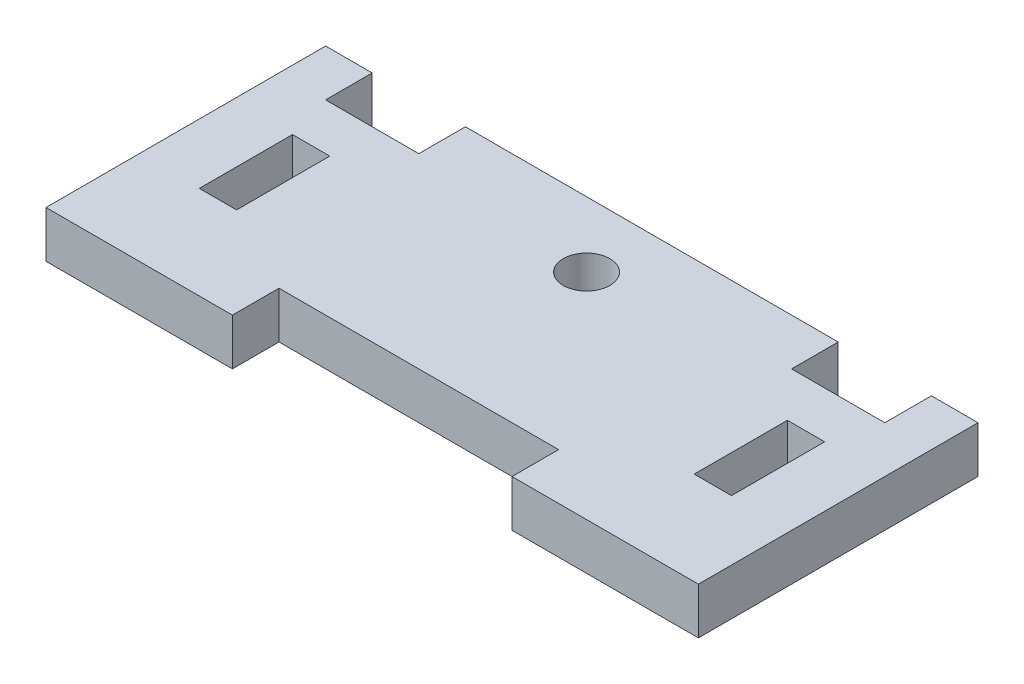
ISO-10303-21;
HEADER;
FILE_DESCRIPTION(('STEP AP214'),'2;1');
FILE_NAME('part.step','',(''),(''),'','','');
FILE_SCHEMA(('AUTOMOTIVE_DESIGN { 1 0 10303 214 1 1 1 1 }'));
ENDSEC;
DATA;
#1=APPLICATION_CONTEXT('core data for automotive mechanical design processes');
#2=APPLICATION_PROTOCOL_DEFINITION('international standard','automotive_design',2000,#1);
#3=PRODUCT_CONTEXT('',#1,'mechanical');
#4=PRODUCT('Part','Part','',(#3));
#5=PRODUCT_RELATED_PRODUCT_CATEGORY('part','',(#4));
#6=PRODUCT_DEFINITION_FORMATION('','',#4);
#7=PRODUCT_DEFINITION_CONTEXT('part definition',#1,'design');
#8=PRODUCT_DEFINITION('design','',#6,#7);
#9=PRODUCT_DEFINITION_SHAPE('','',#8);
#10=(LENGTH_UNIT() NAMED_UNIT(*) SI_UNIT(.MILLI.,.METRE.));
#11=(NAMED_UNIT(*) PLANE_ANGLE_UNIT() SI_UNIT($,.RADIAN.));
#12=(NAMED_UNIT(*) SI_UNIT($,.STERADIAN.) SOLID_ANGLE_UNIT());
#13=UNCERTAINTY_MEASURE_WITH_UNIT(LENGTH_MEASURE(1.E-05),#10,'distance_accuracy_value','');
#14=(GEOMETRIC_REPRESENTATION_CONTEXT(3) GLOBAL_UNCERTAINTY_ASSIGNED_CONTEXT((#13)) GLOBAL_UNIT_ASSIGNED_CONTEXT((#10,
#11,#12)) REPRESENTATION_CONTEXT('',''));
#15=CARTESIAN_POINT('',(0.,0.,0.));
#16=DIRECTION('',(0.,0.,1.));
#17=DIRECTION('',(1.,0.,0.));
#18=AXIS2_PLACEMENT_3D('',#15,#16,#17);
#19=CARTESIAN_POINT('',(0.,5.,0.));
#20=DIRECTION('',(0.,-1.,0.));
#21=DIRECTION('',(0.,0.,-1.));
#22=AXIS2_PLACEMENT_3D('',#19,#20,#21);
#23=PLANE('',#22);
#24=DIRECTION('',(0.,0.,1.));
#25=VECTOR('',#24,1.);
#26=CARTESIAN_POINT('',(6.45,5.,-20.));
#27=LINE('',#26,#25);
#28=CARTESIAN_POINT('',(6.45,5.,-20.));
#29=VERTEX_POINT('',#28);
#30=CARTESIAN_POINT('',(6.45,5.,-10.));
#31=VERTEX_POINT('',#30);
#32=EDGE_CURVE('E234',#29,#31,#27,.T.);
#33=ORIENTED_EDGE('',*,*,#32,.F.);
#34=DIRECTION('',(-1.,0.,0.));
#35=VECTOR('',#34,1.);
#36=CARTESIAN_POINT('',(6.45,5.,-20.));
#37=LINE('',#36,#35);
#38=CARTESIAN_POINT('',(10.45,5.,-20.));
#39=VERTEX_POINT('',#38);
#40=EDGE_CURVE('E242',#39,#29,#37,.T.);
#41=ORIENTED_EDGE('',*,*,#40,.F.);
#42=DIRECTION('',(0.,0.,-1.));
#43=VECTOR('',#42,1.);
#44=CARTESIAN_POINT('',(10.45,5.,-20.));
#45=LINE('',#44,#43);
#46=CARTESIAN_POINT('',(10.45,5.,-10.));
#47=VERTEX_POINT('',#46);
#48=EDGE_CURVE('E239',#47,#39,#45,.T.);
#49=ORIENTED_EDGE('',*,*,#48,.F.);
#50=DIRECTION('',(1.,0.,0.));
#51=VECTOR('',#50,1.);
#52=CARTESIAN_POINT('',(6.45,5.,-10.));
#53=LINE('',#52,#51);
#54=EDGE_CURVE('E236',#31,#47,#53,.T.);
#55=ORIENTED_EDGE('',*,*,#54,.F.);
#56=EDGE_LOOP('',(#33,#41,#49,#55));
#57=FACE_BOUND('',#56,.T.);
#58=DIRECTION('',(0.,0.,1.));
#59=VECTOR('',#58,1.);
#60=CARTESIAN_POINT('',(0.,5.,0.));
#61=LINE('',#60,#59);
#62=CARTESIAN_POINT('',(0.,5.,-30.));
#63=VERTEX_POINT('',#62);
#64=CARTESIAN_POINT('',(0.,5.,0.));
#65=VERTEX_POINT('',#64);
#66=EDGE_CURVE('E271',#63,#65,#61,.T.);
#67=ORIENTED_EDGE('',*,*,#66,.T.);
#68=DIRECTION('',(1.,0.,0.));
#69=VECTOR('',#68,1.);
#70=CARTESIAN_POINT('',(0.,5.,0.));
#71=LINE('',#70,#69);
#72=CARTESIAN_POINT('',(20.,5.,0.));
#73=VERTEX_POINT('',#72);
#74=EDGE_CURVE('E274',#65,#73,#71,.T.);
#75=ORIENTED_EDGE('',*,*,#74,.T.);
#76=DIRECTION('',(0.,0.,-1.));
#77=VECTOR('',#76,1.);
#78=CARTESIAN_POINT('',(20.,5.,0.));
#79=LINE('',#78,#77);
#80=CARTESIAN_POINT('',(20.,5.,-5.));
#81=VERTEX_POINT('',#80);
#82=EDGE_CURVE('E277',#73,#81,#79,.T.);
#83=ORIENTED_EDGE('',*,*,#82,.T.);
#84=DIRECTION('',(1.,0.,0.));
#85=VECTOR('',#84,1.);
#86=CARTESIAN_POINT('',(20.,5.,-5.));
#87=LINE('',#86,#85);
#88=CARTESIAN_POINT('',(50.,5.,-5.));
#89=VERTEX_POINT('',#88);
#90=EDGE_CURVE('E279',#81,#89,#87,.T.);
#91=ORIENTED_EDGE('',*,*,#90,.T.);
#92=DIRECTION('',(0.,0.,1.));
#93=VECTOR('',#92,1.);
#94=CARTESIAN_POINT('',(50.,5.,0.));
#95=LINE('',#94,#93);
#96=CARTESIAN_POINT('',(50.,5.,0.));
#97=VERTEX_POINT('',#96);
#98=EDGE_CURVE('E281',#89,#97,#95,.T.);
#99=ORIENTED_EDGE('',*,*,#98,.T.);
#100=DIRECTION('',(1.,0.,0.));
#101=VECTOR('',#100,1.);
#102=CARTESIAN_POINT('',(50.,5.,0.));
#103=LINE('',#102,#101);
#104=CARTESIAN_POINT('',(70.,5.,0.));
#105=VERTEX_POINT('',#104);
#106=EDGE_CURVE('E283',#97,#105,#103,.T.);
#107=ORIENTED_EDGE('',*,*,#106,.T.);
#108=DIRECTION('',(0.,0.,-1.));
#109=VECTOR('',#108,1.);
#110=CARTESIAN_POINT('',(70.,5.,0.));
#111=LINE('',#110,#109);
#112=CARTESIAN_POINT('',(70.,5.,-30.));
#113=VERTEX_POINT('',#112);
#114=EDGE_CURVE('E285',#105,#113,#111,.T.);
#115=ORIENTED_EDGE('',*,*,#114,.T.);
#116=DIRECTION('',(-1.,0.,0.));
#117=VECTOR('',#116,1.);
#118=CARTESIAN_POINT('',(65.,5.,-30.));
#119=LINE('',#118,#117);
#120=CARTESIAN_POINT('',(65.,5.,-30.));
#121=VERTEX_POINT('',#120);
#122=EDGE_CURVE('E287',#113,#121,#119,.T.);
#123=ORIENTED_EDGE('',*,*,#122,.T.);
#124=DIRECTION('',(0.,0.,1.));
#125=VECTOR('',#124,1.);
#126=CARTESIAN_POINT('',(65.,5.,-30.));
#127=LINE('',#126,#125);
#128=CARTESIAN_POINT('',(65.,5.,-25.));
#129=VERTEX_POINT('',#128);
#130=EDGE_CURVE('E289',#121,#129,#127,.T.);
#131=ORIENTED_EDGE('',*,*,#130,.T.);
#132=DIRECTION('',(-1.,0.,0.));
#133=VECTOR('',#132,1.);
#134=CARTESIAN_POINT('',(55.,5.,-25.));
#135=LINE('',#134,#133);
#136=CARTESIAN_POINT('',(55.,5.,-25.));
#137=VERTEX_POINT('',#136);
#138=EDGE_CURVE('E291',#129,#137,#135,.T.);
#139=ORIENTED_EDGE('',*,*,#138,.T.);
#140=DIRECTION('',(0.,0.,-1.));
#141=VECTOR('',#140,1.);
#142=CARTESIAN_POINT('',(55.,5.,-30.));
#143=LINE('',#142,#141);
#144=CARTESIAN_POINT('',(55.,5.,-30.));
#145=VERTEX_POINT('',#144);
#146=EDGE_CURVE('E293',#137,#145,#143,.T.);
#147=ORIENTED_EDGE('',*,*,#146,.T.);
#148=DIRECTION('',(-1.,0.,0.));
#149=VECTOR('',#148,1.);
#150=CARTESIAN_POINT('',(15.,5.,-30.));
#151=LINE('',#150,#149);
#152=CARTESIAN_POINT('',(15.,5.,-30.));
#153=VERTEX_POINT('',#152);
#154=EDGE_CURVE('E295',#145,#153,#151,.T.);
#155=ORIENTED_EDGE('',*,*,#154,.T.);
#156=DIRECTION('',(0.,0.,1.));
#157=VECTOR('',#156,1.);
#158=CARTESIAN_POINT('',(15.,5.,-30.));
#159=LINE('',#158,#157);
#160=CARTESIAN_POINT('',(15.,5.,-25.));
#161=VERTEX_POINT('',#160);
#162=EDGE_CURVE('E297',#153,#161,#159,.T.);
#163=ORIENTED_EDGE('',*,*,#162,.T.);
#164=DIRECTION('',(-1.,0.,0.));
#165=VECTOR('',#164,1.);
#166=CARTESIAN_POINT('',(5.,5.,-25.));
#167=LINE('',#166,#165);
#168=CARTESIAN_POINT('',(5.,5.,-25.));
#169=VERTEX_POINT('',#168);
#170=EDGE_CURVE('E299',#161,#169,#167,.T.);
#171=ORIENTED_EDGE('',*,*,#170,.T.);
#172=DIRECTION('',(0.,0.,-1.));
#173=VECTOR('',#172,1.);
#174=CARTESIAN_POINT('',(5.,5.,-30.));
#175=LINE('',#174,#173);
#176=CARTESIAN_POINT('',(5.,5.,-30.));
#177=VERTEX_POINT('',#176);
#178=EDGE_CURVE('E301',#169,#177,#175,.T.);
#179=ORIENTED_EDGE('',*,*,#178,.T.);
#180=DIRECTION('',(-1.,0.,0.));
#181=VECTOR('',#180,1.);
#182=CARTESIAN_POINT('',(0.,5.,-30.));
#183=LINE('',#182,#181);
#184=EDGE_CURVE('E303',#177,#63,#183,.T.);
#185=ORIENTED_EDGE('',*,*,#184,.T.);
#186=EDGE_LOOP('',(#67,#75,#83,#91,#99,#107,#115,#123,#131,#139,#147,#155,#163,#171,#179,#185));
#187=FACE_BOUND('',#186,.T.);
#188=CARTESIAN_POINT('',(35.,5.,-23.));
#189=DIRECTION('',(0.,1.,0.));
#190=DIRECTION('',(0.,0.,1.));
#191=AXIS2_PLACEMENT_3D('',#188,#189,#190);
#192=CIRCLE('',#191,2.5);
#193=CARTESIAN_POINT('',(35.,5.,-20.5));
#194=VERTEX_POINT('',#193);
#195=EDGE_CURVE('E265',#194,#194,#192,.T.);
#196=ORIENTED_EDGE('',*,*,#195,.F.);
#197=EDGE_LOOP('',(#196));
#198=FACE_BOUND('',#197,.T.);
#199=DIRECTION('',(0.,0.,1.));
#200=VECTOR('',#199,1.);
#201=CARTESIAN_POINT('',(59.55,5.,-20.));
#202=LINE('',#201,#200);
#203=CARTESIAN_POINT('',(59.55,5.,-20.));
#204=VERTEX_POINT('',#203);
#205=CARTESIAN_POINT('',(59.55,5.,-10.));
#206=VERTEX_POINT('',#205);
#207=EDGE_CURVE('E198',#204,#206,#202,.T.);
#208=ORIENTED_EDGE('',*,*,#207,.F.);
#209=DIRECTION('',(-1.,0.,0.));
#210=VECTOR('',#209,1.);
#211=CARTESIAN_POINT('',(59.55,5.,-20.));
#212=LINE('',#211,#210);
#213=CARTESIAN_POINT('',(63.55,5.,-20.));
#214=VERTEX_POINT('',#213);
#215=EDGE_CURVE('E220',#214,#204,#212,.T.);
#216=ORIENTED_EDGE('',*,*,#215,.F.);
#217=DIRECTION('',(0.,0.,-1.));
#218=VECTOR('',#217,1.);
#219=CARTESIAN_POINT('',(63.55,5.,-20.));
#220=LINE('',#219,#218);
#221=CARTESIAN_POINT('',(63.55,5.,-10.));
#222=VERTEX_POINT('',#221);
#223=EDGE_CURVE('E218',#222,#214,#220,.T.);
#224=ORIENTED_EDGE('',*,*,#223,.F.);
#225=DIRECTION('',(1.,0.,0.));
#226=VECTOR('',#225,1.);
#227=CARTESIAN_POINT('',(59.55,5.,-10.));
#228=LINE('',#227,#226);
#229=EDGE_CURVE('E206',#206,#222,#228,.T.);
#230=ORIENTED_EDGE('',*,*,#229,.F.);
#231=EDGE_LOOP('',(#208,#216,#224,#230));
#232=FACE_BOUND('',#231,.T.);
#233=ADVANCED_FACE('F37',(#57,#187,#198,#232),#23,.F.);
#234=CARTESIAN_POINT('',(0.,0.,0.));
#235=DIRECTION('',(0.,-1.,0.));
#236=DIRECTION('',(0.,0.,-1.));
#237=AXIS2_PLACEMENT_3D('',#234,#235,#236);
#238=PLANE('',#237);
#239=DIRECTION('',(0.,0.,1.));
#240=VECTOR('',#239,1.);
#241=CARTESIAN_POINT('',(0.,0.,0.));
#242=LINE('',#241,#240);
#243=CARTESIAN_POINT('',(0.,0.,-30.));
#244=VERTEX_POINT('',#243);
#245=CARTESIAN_POINT('',(0.,0.,0.));
#246=VERTEX_POINT('',#245);
#247=EDGE_CURVE('E268',#244,#246,#242,.T.);
#248=ORIENTED_EDGE('',*,*,#247,.F.);
#249=DIRECTION('',(-1.,0.,0.));
#250=VECTOR('',#249,1.);
#251=CARTESIAN_POINT('',(0.,0.,-30.));
#252=LINE('',#251,#250);
#253=CARTESIAN_POINT('',(5.,0.,-30.));
#254=VERTEX_POINT('',#253);
#255=EDGE_CURVE('E275',#254,#244,#252,.T.);
#256=ORIENTED_EDGE('',*,*,#255,.F.);
#257=DIRECTION('',(0.,0.,-1.));
#258=VECTOR('',#257,1.);
#259=CARTESIAN_POINT('',(5.,0.,-30.));
#260=LINE('',#259,#258);
#261=CARTESIAN_POINT('',(5.,0.,-25.));
#262=VERTEX_POINT('',#261);
#263=EDGE_CURVE('E334',#262,#254,#260,.T.);
#264=ORIENTED_EDGE('',*,*,#263,.F.);
#265=DIRECTION('',(-1.,0.,0.));
#266=VECTOR('',#265,1.);
#267=CARTESIAN_POINT('',(5.,0.,-25.));
#268=LINE('',#267,#266);
#269=CARTESIAN_POINT('',(15.,0.,-25.));
#270=VERTEX_POINT('',#269);
#271=EDGE_CURVE('E332',#270,#262,#268,.T.);
#272=ORIENTED_EDGE('',*,*,#271,.F.);
#273=DIRECTION('',(0.,0.,1.));
#274=VECTOR('',#273,1.);
#275=CARTESIAN_POINT('',(15.,0.,-30.));
#276=LINE('',#275,#274);
#277=CARTESIAN_POINT('',(15.,0.,-30.));
#278=VERTEX_POINT('',#277);
#279=EDGE_CURVE('E330',#278,#270,#276,.T.);
#280=ORIENTED_EDGE('',*,*,#279,.F.);
#281=DIRECTION('',(-1.,0.,0.));
#282=VECTOR('',#281,1.);
#283=CARTESIAN_POINT('',(15.,0.,-30.));
#284=LINE('',#283,#282);
#285=CARTESIAN_POINT('',(55.,0.,-30.));
#286=VERTEX_POINT('',#285);
#287=EDGE_CURVE('E328',#286,#278,#284,.T.);
#288=ORIENTED_EDGE('',*,*,#287,.F.);
#289=DIRECTION('',(0.,0.,-1.));
#290=VECTOR('',#289,1.);
#291=CARTESIAN_POINT('',(55.,0.,-30.));
#292=LINE('',#291,#290);
#293=CARTESIAN_POINT('',(55.,0.,-25.));
#294=VERTEX_POINT('',#293);
#295=EDGE_CURVE('E326',#294,#286,#292,.T.);
#296=ORIENTED_EDGE('',*,*,#295,.F.);
#297=DIRECTION('',(-1.,0.,0.));
#298=VECTOR('',#297,1.);
#299=CARTESIAN_POINT('',(55.,0.,-25.));
#300=LINE('',#299,#298);
#301=CARTESIAN_POINT('',(65.,0.,-25.));
#302=VERTEX_POINT('',#301);
#303=EDGE_CURVE('E324',#302,#294,#300,.T.);
#304=ORIENTED_EDGE('',*,*,#303,.F.);
#305=DIRECTION('',(0.,0.,1.));
#306=VECTOR('',#305,1.);
#307=CARTESIAN_POINT('',(65.,0.,-30.));
#308=LINE('',#307,#306);
#309=CARTESIAN_POINT('',(65.,0.,-30.));
#310=VERTEX_POINT('',#309);
#311=EDGE_CURVE('E322',#310,#302,#308,.T.);
#312=ORIENTED_EDGE('',*,*,#311,.F.);
#313=DIRECTION('',(-1.,0.,0.));
#314=VECTOR('',#313,1.);
#315=CARTESIAN_POINT('',(65.,0.,-30.));
#316=LINE('',#315,#314);
#317=CARTESIAN_POINT('',(70.,0.,-30.));
#318=VERTEX_POINT('',#317);
#319=EDGE_CURVE('E320',#318,#310,#316,.T.);
#320=ORIENTED_EDGE('',*,*,#319,.F.);
#321=DIRECTION('',(0.,0.,-1.));
#322=VECTOR('',#321,1.);
#323=CARTESIAN_POINT('',(70.,0.,0.));
#324=LINE('',#323,#322);
#325=CARTESIAN_POINT('',(70.,0.,0.));
#326=VERTEX_POINT('',#325);
#327=EDGE_CURVE('E318',#326,#318,#324,.T.);
#328=ORIENTED_EDGE('',*,*,#327,.F.);
#329=DIRECTION('',(1.,0.,0.));
#330=VECTOR('',#329,1.);
#331=CARTESIAN_POINT('',(50.,0.,0.));
#332=LINE('',#331,#330);
#333=CARTESIAN_POINT('',(50.,0.,0.));
#334=VERTEX_POINT('',#333);
#335=EDGE_CURVE('E316',#334,#326,#332,.T.);
#336=ORIENTED_EDGE('',*,*,#335,.F.);
#337=DIRECTION('',(0.,0.,1.));
#338=VECTOR('',#337,1.);
#339=CARTESIAN_POINT('',(50.,0.,0.));
#340=LINE('',#339,#338);
#341=CARTESIAN_POINT('',(50.,0.,-5.));
#342=VERTEX_POINT('',#341);
#343=EDGE_CURVE('E314',#342,#334,#340,.T.);
#344=ORIENTED_EDGE('',*,*,#343,.F.);
#345=DIRECTION('',(1.,0.,0.));
#346=VECTOR('',#345,1.);
#347=CARTESIAN_POINT('',(20.,0.,-5.));
#348=LINE('',#347,#346);
#349=CARTESIAN_POINT('',(20.,0.,-5.));
#350=VERTEX_POINT('',#349);
#351=EDGE_CURVE('E312',#350,#342,#348,.T.);
#352=ORIENTED_EDGE('',*,*,#351,.F.);
#353=DIRECTION('',(0.,0.,-1.));
#354=VECTOR('',#353,1.);
#355=CARTESIAN_POINT('',(20.,0.,0.));
#356=LINE('',#355,#354);
#357=CARTESIAN_POINT('',(20.,0.,0.));
#358=VERTEX_POINT('',#357);
#359=EDGE_CURVE('E310',#358,#350,#356,.T.);
#360=ORIENTED_EDGE('',*,*,#359,.F.);
#361=DIRECTION('',(1.,0.,0.));
#362=VECTOR('',#361,1.);
#363=CARTESIAN_POINT('',(0.,0.,0.));
#364=LINE('',#363,#362);
#365=EDGE_CURVE('E308',#246,#358,#364,.T.);
#366=ORIENTED_EDGE('',*,*,#365,.F.);
#367=EDGE_LOOP('',(#248,#256,#264,#272,#280,#288,#296,#304,#312,#320,#328,#336,#344,#352,#360,#366));
#368=FACE_BOUND('',#367,.T.);
#369=CARTESIAN_POINT('',(35.,0.,-23.));
#370=DIRECTION('',(0.,1.,0.));
#371=DIRECTION('',(0.,0.,1.));
#372=AXIS2_PLACEMENT_3D('',#369,#370,#371);
#373=CIRCLE('',#372,2.5);
#374=CARTESIAN_POINT('',(35.,0.,-20.5));
#375=VERTEX_POINT('',#374);
#376=EDGE_CURVE('E264',#375,#375,#373,.T.);
#377=ORIENTED_EDGE('',*,*,#376,.T.);
#378=EDGE_LOOP('',(#377));
#379=FACE_BOUND('',#378,.T.);
#380=DIRECTION('',(-1.,0.,0.));
#381=VECTOR('',#380,1.);
#382=CARTESIAN_POINT('',(6.45,0.,-20.));
#383=LINE('',#382,#381);
#384=CARTESIAN_POINT('',(10.45,0.,-20.));
#385=VERTEX_POINT('',#384);
#386=CARTESIAN_POINT('',(6.45,0.,-20.));
#387=VERTEX_POINT('',#386);
#388=EDGE_CURVE('E237',#385,#387,#383,.T.);
#389=ORIENTED_EDGE('',*,*,#388,.T.);
#390=DIRECTION('',(0.,0.,1.));
#391=VECTOR('',#390,1.);
#392=CARTESIAN_POINT('',(6.45,0.,-20.));
#393=LINE('',#392,#391);
#394=CARTESIAN_POINT('',(6.45,0.,-10.));
#395=VERTEX_POINT('',#394);
#396=EDGE_CURVE('E214',#387,#395,#393,.T.);
#397=ORIENTED_EDGE('',*,*,#396,.T.);
#398=DIRECTION('',(1.,0.,0.));
#399=VECTOR('',#398,1.);
#400=CARTESIAN_POINT('',(6.45,0.,-10.));
#401=LINE('',#400,#399);
#402=CARTESIAN_POINT('',(10.45,0.,-10.));
#403=VERTEX_POINT('',#402);
#404=EDGE_CURVE('E247',#395,#403,#401,.T.);
#405=ORIENTED_EDGE('',*,*,#404,.T.);
#406=DIRECTION('',(0.,0.,-1.));
#407=VECTOR('',#406,1.);
#408=CARTESIAN_POINT('',(10.45,0.,-20.));
#409=LINE('',#408,#407);
#410=EDGE_CURVE('E250',#403,#385,#409,.T.);
#411=ORIENTED_EDGE('',*,*,#410,.T.);
#412=EDGE_LOOP('',(#389,#397,#405,#411));
#413=FACE_BOUND('',#412,.T.);
#414=DIRECTION('',(-1.,0.,0.));
#415=VECTOR('',#414,1.);
#416=CARTESIAN_POINT('',(59.55,0.,-20.));
#417=LINE('',#416,#415);
#418=CARTESIAN_POINT('',(63.55,0.,-20.));
#419=VERTEX_POINT('',#418);
#420=CARTESIAN_POINT('',(59.55,0.,-20.));
#421=VERTEX_POINT('',#420);
#422=EDGE_CURVE('E207',#419,#421,#417,.T.);
#423=ORIENTED_EDGE('',*,*,#422,.T.);
#424=DIRECTION('',(0.,0.,1.));
#425=VECTOR('',#424,1.);
#426=CARTESIAN_POINT('',(59.55,0.,-20.));
#427=LINE('',#426,#425);
#428=CARTESIAN_POINT('',(59.55,0.,-10.));
#429=VERTEX_POINT('',#428);
#430=EDGE_CURVE('E60',#421,#429,#427,.T.);
#431=ORIENTED_EDGE('',*,*,#430,.T.);
#432=DIRECTION('',(1.,0.,0.));
#433=VECTOR('',#432,1.);
#434=CARTESIAN_POINT('',(59.55,0.,-10.));
#435=LINE('',#434,#433);
#436=CARTESIAN_POINT('',(63.55,0.,-10.));
#437=VERTEX_POINT('',#436);
#438=EDGE_CURVE('E213',#429,#437,#435,.T.);
#439=ORIENTED_EDGE('',*,*,#438,.T.);
#440=DIRECTION('',(0.,0.,-1.));
#441=VECTOR('',#440,1.);
#442=CARTESIAN_POINT('',(63.55,0.,-20.));
#443=LINE('',#442,#441);
#444=EDGE_CURVE('E226',#437,#419,#443,.T.);
#445=ORIENTED_EDGE('',*,*,#444,.T.);
#446=EDGE_LOOP('',(#423,#431,#439,#445));
#447=FACE_BOUND('',#446,.T.);
#448=ADVANCED_FACE('F388',(#368,#379,#413,#447),#238,.T.);
#449=CARTESIAN_POINT('',(0.,5.,0.));
#450=DIRECTION('',(1.,0.,0.));
#451=DIRECTION('',(0.,0.,-1.));
#452=AXIS2_PLACEMENT_3D('',#449,#450,#451);
#453=PLANE('',#452);
#454=ORIENTED_EDGE('',*,*,#247,.T.);
#455=DIRECTION('',(0.,-1.,0.));
#456=VECTOR('',#455,1.);
#457=CARTESIAN_POINT('',(0.,5.,0.));
#458=LINE('',#457,#456);
#459=EDGE_CURVE('E11',#65,#246,#458,.T.);
#460=ORIENTED_EDGE('',*,*,#459,.F.);
#461=ORIENTED_EDGE('',*,*,#66,.F.);
#462=DIRECTION('',(0.,-1.,0.));
#463=VECTOR('',#462,1.);
#464=CARTESIAN_POINT('',(0.,5.,-30.));
#465=LINE('',#464,#463);
#466=EDGE_CURVE('E305',#63,#244,#465,.T.);
#467=ORIENTED_EDGE('',*,*,#466,.T.);
#468=EDGE_LOOP('',(#454,#460,#461,#467));
#469=FACE_BOUND('',#468,.T.);
#470=ADVANCED_FACE('F39',(#469),#453,.F.);
#471=CARTESIAN_POINT('',(0.,5.,0.));
#472=DIRECTION('',(0.,0.,-1.));
#473=DIRECTION('',(-1.,0.,0.));
#474=AXIS2_PLACEMENT_3D('',#471,#472,#473);
#475=PLANE('',#474);
#476=ORIENTED_EDGE('',*,*,#365,.T.);
#477=DIRECTION('',(0.,-1.,0.));
#478=VECTOR('',#477,1.);
#479=CARTESIAN_POINT('',(20.,5.,0.));
#480=LINE('',#479,#478);
#481=EDGE_CURVE('E45',#73,#358,#480,.T.);
#482=ORIENTED_EDGE('',*,*,#481,.F.);
#483=ORIENTED_EDGE('',*,*,#74,.F.);
#484=ORIENTED_EDGE('',*,*,#459,.T.);
#485=EDGE_LOOP('',(#476,#482,#483,#484));
#486=FACE_BOUND('',#485,.T.);
#487=ADVANCED_FACE('F406',(#486),#475,.F.);
#488=CARTESIAN_POINT('',(20.,5.,0.));
#489=DIRECTION('',(-1.,0.,0.));
#490=DIRECTION('',(0.,0.,1.));
#491=AXIS2_PLACEMENT_3D('',#488,#489,#490);
#492=PLANE('',#491);
#493=ORIENTED_EDGE('',*,*,#359,.T.);
#494=DIRECTION('',(0.,-1.,0.));
#495=VECTOR('',#494,1.);
#496=CARTESIAN_POINT('',(20.,5.,-5.));
#497=LINE('',#496,#495);
#498=EDGE_CURVE('E375',#81,#350,#497,.T.);
#499=ORIENTED_EDGE('',*,*,#498,.F.);
#500=ORIENTED_EDGE('',*,*,#82,.F.);
#501=ORIENTED_EDGE('',*,*,#481,.T.);
#502=EDGE_LOOP('',(#493,#499,#500,#501));
#503=FACE_BOUND('',#502,.T.);
#504=ADVANCED_FACE('F382',(#503),#492,.F.);
#505=CARTESIAN_POINT('',(20.,5.,-5.));
#506=DIRECTION('',(0.,0.,-1.));
#507=DIRECTION('',(-1.,0.,0.));
#508=AXIS2_PLACEMENT_3D('',#505,#506,#507);
#509=PLANE('',#508);
#510=ORIENTED_EDGE('',*,*,#351,.T.);
#511=DIRECTION('',(0.,-1.,0.));
#512=VECTOR('',#511,1.);
#513=CARTESIAN_POINT('',(50.,5.,-5.));
#514=LINE('',#513,#512);
#515=EDGE_CURVE('E372',#89,#342,#514,.T.);
#516=ORIENTED_EDGE('',*,*,#515,.F.);
#517=ORIENTED_EDGE('',*,*,#90,.F.);
#518=ORIENTED_EDGE('',*,*,#498,.T.);
#519=EDGE_LOOP('',(#510,#516,#517,#518));
#520=FACE_BOUND('',#519,.T.);
#521=ADVANCED_FACE('F394',(#520),#509,.F.);
#522=CARTESIAN_POINT('',(50.,5.,0.));
#523=DIRECTION('',(1.,0.,0.));
#524=DIRECTION('',(0.,0.,-1.));
#525=AXIS2_PLACEMENT_3D('',#522,#523,#524);
#526=PLANE('',#525);
#527=ORIENTED_EDGE('',*,*,#343,.T.);
#528=DIRECTION('',(0.,-1.,0.));
#529=VECTOR('',#528,1.);
#530=CARTESIAN_POINT('',(50.,5.,0.));
#531=LINE('',#530,#529);
#532=EDGE_CURVE('E369',#97,#334,#531,.T.);
#533=ORIENTED_EDGE('',*,*,#532,.F.);
#534=ORIENTED_EDGE('',*,*,#98,.F.);
#535=ORIENTED_EDGE('',*,*,#515,.T.);
#536=EDGE_LOOP('',(#527,#533,#534,#535));
#537=FACE_BOUND('',#536,.T.);
#538=ADVANCED_FACE('F398',(#537),#526,.F.);
#539=CARTESIAN_POINT('',(50.,5.,0.));
#540=DIRECTION('',(0.,0.,-1.));
#541=DIRECTION('',(-1.,0.,0.));
#542=AXIS2_PLACEMENT_3D('',#539,#540,#541);
#543=PLANE('',#542);
#544=ORIENTED_EDGE('',*,*,#335,.T.);
#545=DIRECTION('',(0.,-1.,0.));
#546=VECTOR('',#545,1.);
#547=CARTESIAN_POINT('',(70.,5.,0.));
#548=LINE('',#547,#546);
#549=EDGE_CURVE('E366',#105,#326,#548,.T.);
#550=ORIENTED_EDGE('',*,*,#549,.F.);
#551=ORIENTED_EDGE('',*,*,#106,.F.);
#552=ORIENTED_EDGE('',*,*,#532,.T.);
#553=EDGE_LOOP('',(#544,#550,#551,#552));
#554=FACE_BOUND('',#553,.T.);
#555=ADVANCED_FACE('F459',(#554),#543,.F.);
#556=CARTESIAN_POINT('',(70.,5.,0.));
#557=DIRECTION('',(-1.,0.,0.));
#558=DIRECTION('',(0.,0.,1.));
#559=AXIS2_PLACEMENT_3D('',#556,#557,#558);
#560=PLANE('',#559);
#561=ORIENTED_EDGE('',*,*,#327,.T.);
#562=DIRECTION('',(0.,-1.,0.));
#563=VECTOR('',#562,1.);
#564=CARTESIAN_POINT('',(70.,5.,-30.));
#565=LINE('',#564,#563);
#566=EDGE_CURVE('E363',#113,#318,#565,.T.);
#567=ORIENTED_EDGE('',*,*,#566,.F.);
#568=ORIENTED_EDGE('',*,*,#114,.F.);
#569=ORIENTED_EDGE('',*,*,#549,.T.);
#570=EDGE_LOOP('',(#561,#567,#568,#569));
#571=FACE_BOUND('',#570,.T.);
#572=ADVANCED_FACE('F456',(#571),#560,.F.);
#573=CARTESIAN_POINT('',(65.,5.,-30.));
#574=DIRECTION('',(0.,0.,1.));
#575=DIRECTION('',(1.,0.,0.));
#576=AXIS2_PLACEMENT_3D('',#573,#574,#575);
#577=PLANE('',#576);
#578=ORIENTED_EDGE('',*,*,#319,.T.);
#579=DIRECTION('',(0.,-1.,0.));
#580=VECTOR('',#579,1.);
#581=CARTESIAN_POINT('',(65.,5.,-30.));
#582=LINE('',#581,#580);
#583=EDGE_CURVE('E360',#121,#310,#582,.T.);
#584=ORIENTED_EDGE('',*,*,#583,.F.);
#585=ORIENTED_EDGE('',*,*,#122,.F.);
#586=ORIENTED_EDGE('',*,*,#566,.T.);
#587=EDGE_LOOP('',(#578,#584,#585,#586));
#588=FACE_BOUND('',#587,.T.);
#589=ADVANCED_FACE('F452',(#588),#577,.F.);
#590=CARTESIAN_POINT('',(65.,5.,-30.));
#591=DIRECTION('',(1.,0.,0.));
#592=DIRECTION('',(0.,0.,-1.));
#593=AXIS2_PLACEMENT_3D('',#590,#591,#592);
#594=PLANE('',#593);
#595=ORIENTED_EDGE('',*,*,#311,.T.);
#596=DIRECTION('',(0.,-1.,0.));
#597=VECTOR('',#596,1.);
#598=CARTESIAN_POINT('',(65.,5.,-25.));
#599=LINE('',#598,#597);
#600=EDGE_CURVE('E357',#129,#302,#599,.T.);
#601=ORIENTED_EDGE('',*,*,#600,.F.);
#602=ORIENTED_EDGE('',*,*,#130,.F.);
#603=ORIENTED_EDGE('',*,*,#583,.T.);
#604=EDGE_LOOP('',(#595,#601,#602,#603));
#605=FACE_BOUND('',#604,.T.);
#606=ADVANCED_FACE('F448',(#605),#594,.F.);
#607=CARTESIAN_POINT('',(55.,5.,-25.));
#608=DIRECTION('',(0.,0.,1.));
#609=DIRECTION('',(1.,0.,0.));
#610=AXIS2_PLACEMENT_3D('',#607,#608,#609);
#611=PLANE('',#610);
#612=ORIENTED_EDGE('',*,*,#303,.T.);
#613=DIRECTION('',(0.,-1.,0.));
#614=VECTOR('',#613,1.);
#615=CARTESIAN_POINT('',(55.,5.,-25.));
#616=LINE('',#615,#614);
#617=EDGE_CURVE('E354',#137,#294,#616,.T.);
#618=ORIENTED_EDGE('',*,*,#617,.F.);
#619=ORIENTED_EDGE('',*,*,#138,.F.);
#620=ORIENTED_EDGE('',*,*,#600,.T.);
#621=EDGE_LOOP('',(#612,#618,#619,#620));
#622=FACE_BOUND('',#621,.T.);
#623=ADVANCED_FACE('F443',(#622),#611,.F.);
#624=CARTESIAN_POINT('',(55.,5.,-30.));
#625=DIRECTION('',(-1.,0.,0.));
#626=DIRECTION('',(0.,0.,1.));
#627=AXIS2_PLACEMENT_3D('',#624,#625,#626);
#628=PLANE('',#627);
#629=ORIENTED_EDGE('',*,*,#295,.T.);
#630=DIRECTION('',(0.,-1.,0.));
#631=VECTOR('',#630,1.);
#632=CARTESIAN_POINT('',(55.,5.,-30.));
#633=LINE('',#632,#631);
#634=EDGE_CURVE('E351',#145,#286,#633,.T.);
#635=ORIENTED_EDGE('',*,*,#634,.F.);
#636=ORIENTED_EDGE('',*,*,#146,.F.);
#637=ORIENTED_EDGE('',*,*,#617,.T.);
#638=EDGE_LOOP('',(#629,#635,#636,#637));
#639=FACE_BOUND('',#638,.T.);
#640=ADVANCED_FACE('F437',(#639),#628,.F.);
#641=CARTESIAN_POINT('',(15.,5.,-30.));
#642=DIRECTION('',(0.,0.,1.));
#643=DIRECTION('',(1.,0.,0.));
#644=AXIS2_PLACEMENT_3D('',#641,#642,#643);
#645=PLANE('',#644);
#646=ORIENTED_EDGE('',*,*,#287,.T.);
#647=DIRECTION('',(0.,-1.,0.));
#648=VECTOR('',#647,1.);
#649=CARTESIAN_POINT('',(15.,5.,-30.));
#650=LINE('',#649,#648);
#651=EDGE_CURVE('E348',#153,#278,#650,.T.);
#652=ORIENTED_EDGE('',*,*,#651,.F.);
#653=ORIENTED_EDGE('',*,*,#154,.F.);
#654=ORIENTED_EDGE('',*,*,#634,.T.);
#655=EDGE_LOOP('',(#646,#652,#653,#654));
#656=FACE_BOUND('',#655,.T.);
#657=ADVANCED_FACE('F433',(#656),#645,.F.);
#658=CARTESIAN_POINT('',(15.,5.,-30.));
#659=DIRECTION('',(1.,0.,0.));
#660=DIRECTION('',(0.,0.,-1.));
#661=AXIS2_PLACEMENT_3D('',#658,#659,#660);
#662=PLANE('',#661);
#663=ORIENTED_EDGE('',*,*,#279,.T.);
#664=DIRECTION('',(0.,-1.,0.));
#665=VECTOR('',#664,1.);
#666=CARTESIAN_POINT('',(15.,5.,-25.));
#667=LINE('',#666,#665);
#668=EDGE_CURVE('E345',#161,#270,#667,.T.);
#669=ORIENTED_EDGE('',*,*,#668,.F.);
#670=ORIENTED_EDGE('',*,*,#162,.F.);
#671=ORIENTED_EDGE('',*,*,#651,.T.);
#672=EDGE_LOOP('',(#663,#669,#670,#671));
#673=FACE_BOUND('',#672,.T.);
#674=ADVANCED_FACE('F428',(#673),#662,.F.);
#675=CARTESIAN_POINT('',(5.,5.,-25.));
#676=DIRECTION('',(0.,0.,1.));
#677=DIRECTION('',(1.,0.,0.));
#678=AXIS2_PLACEMENT_3D('',#675,#676,#677);
#679=PLANE('',#678);
#680=ORIENTED_EDGE('',*,*,#271,.T.);
#681=DIRECTION('',(0.,-1.,0.));
#682=VECTOR('',#681,1.);
#683=CARTESIAN_POINT('',(5.,5.,-25.));
#684=LINE('',#683,#682);
#685=EDGE_CURVE('E342',#169,#262,#684,.T.);
#686=ORIENTED_EDGE('',*,*,#685,.F.);
#687=ORIENTED_EDGE('',*,*,#170,.F.);
#688=ORIENTED_EDGE('',*,*,#668,.T.);
#689=EDGE_LOOP('',(#680,#686,#687,#688));
#690=FACE_BOUND('',#689,.T.);
#691=ADVANCED_FACE('F422',(#690),#679,.F.);
#692=CARTESIAN_POINT('',(5.,5.,-30.));
#693=DIRECTION('',(-1.,0.,0.));
#694=DIRECTION('',(0.,0.,1.));
#695=AXIS2_PLACEMENT_3D('',#692,#693,#694);
#696=PLANE('',#695);
#697=ORIENTED_EDGE('',*,*,#263,.T.);
#698=DIRECTION('',(0.,-1.,0.));
#699=VECTOR('',#698,1.);
#700=CARTESIAN_POINT('',(5.,5.,-30.));
#701=LINE('',#700,#699);
#702=EDGE_CURVE('E339',#177,#254,#701,.T.);
#703=ORIENTED_EDGE('',*,*,#702,.F.);
#704=ORIENTED_EDGE('',*,*,#178,.F.);
#705=ORIENTED_EDGE('',*,*,#685,.T.);
#706=EDGE_LOOP('',(#697,#703,#704,#705));
#707=FACE_BOUND('',#706,.T.);
#708=ADVANCED_FACE('F418',(#707),#696,.F.);
#709=CARTESIAN_POINT('',(0.,5.,-30.));
#710=DIRECTION('',(0.,0.,1.));
#711=DIRECTION('',(1.,0.,0.));
#712=AXIS2_PLACEMENT_3D('',#709,#710,#711);
#713=PLANE('',#712);
#714=ORIENTED_EDGE('',*,*,#255,.T.);
#715=ORIENTED_EDGE('',*,*,#466,.F.);
#716=ORIENTED_EDGE('',*,*,#184,.F.);
#717=ORIENTED_EDGE('',*,*,#702,.T.);
#718=EDGE_LOOP('',(#714,#715,#716,#717));
#719=FACE_BOUND('',#718,.T.);
#720=ADVANCED_FACE('F413',(#719),#713,.F.);
#721=CARTESIAN_POINT('',(35.,5.,-23.));
#722=DIRECTION('',(0.,-1.,0.));
#723=DIRECTION('',(0.,0.,-1.));
#724=AXIS2_PLACEMENT_3D('',#721,#722,#723);
#725=CYLINDRICAL_SURFACE('',#724,2.5);
#726=ORIENTED_EDGE('',*,*,#195,.T.);
#727=EDGE_LOOP('',(#726));
#728=FACE_BOUND('',#727,.T.);
#729=ORIENTED_EDGE('',*,*,#376,.F.);
#730=EDGE_LOOP('',(#729));
#731=FACE_BOUND('',#730,.T.);
#732=ADVANCED_FACE('F477',(#728,#731),#725,.F.);
#733=CARTESIAN_POINT('',(6.45,5.,-20.));
#734=DIRECTION('',(1.,0.,0.));
#735=DIRECTION('',(0.,0.,-1.));
#736=AXIS2_PLACEMENT_3D('',#733,#734,#735);
#737=PLANE('',#736);
#738=ORIENTED_EDGE('',*,*,#396,.F.);
#739=DIRECTION('',(0.,-1.,0.));
#740=VECTOR('',#739,1.);
#741=CARTESIAN_POINT('',(6.45,5.,-20.));
#742=LINE('',#741,#740);
#743=EDGE_CURVE('E244',#29,#387,#742,.T.);
#744=ORIENTED_EDGE('',*,*,#743,.F.);
#745=ORIENTED_EDGE('',*,*,#32,.T.);
#746=DIRECTION('',(0.,-1.,0.));
#747=VECTOR('',#746,1.);
#748=CARTESIAN_POINT('',(6.45,5.,-10.));
#749=LINE('',#748,#747);
#750=EDGE_CURVE('E261',#31,#395,#749,.T.);
#751=ORIENTED_EDGE('',*,*,#750,.T.);
#752=EDGE_LOOP('',(#738,#744,#745,#751));
#753=FACE_BOUND('',#752,.T.);
#754=ADVANCED_FACE('F539',(#753),#737,.T.);
#755=CARTESIAN_POINT('',(6.45,5.,-10.));
#756=DIRECTION('',(0.,0.,-1.));
#757=DIRECTION('',(-1.,0.,0.));
#758=AXIS2_PLACEMENT_3D('',#755,#756,#757);
#759=PLANE('',#758);
#760=ORIENTED_EDGE('',*,*,#404,.F.);
#761=ORIENTED_EDGE('',*,*,#750,.F.);
#762=ORIENTED_EDGE('',*,*,#54,.T.);
#763=DIRECTION('',(0.,-1.,0.));
#764=VECTOR('',#763,1.);
#765=CARTESIAN_POINT('',(10.45,5.,-10.));
#766=LINE('',#765,#764);
#767=EDGE_CURVE('E259',#47,#403,#766,.T.);
#768=ORIENTED_EDGE('',*,*,#767,.T.);
#769=EDGE_LOOP('',(#760,#761,#762,#768));
#770=FACE_BOUND('',#769,.T.);
#771=ADVANCED_FACE('F546',(#770),#759,.T.);
#772=CARTESIAN_POINT('',(10.45,5.,-20.));
#773=DIRECTION('',(-1.,0.,0.));
#774=DIRECTION('',(0.,0.,1.));
#775=AXIS2_PLACEMENT_3D('',#772,#773,#774);
#776=PLANE('',#775);
#777=ORIENTED_EDGE('',*,*,#410,.F.);
#778=ORIENTED_EDGE('',*,*,#767,.F.);
#779=ORIENTED_EDGE('',*,*,#48,.T.);
#780=DIRECTION('',(0.,-1.,0.));
#781=VECTOR('',#780,1.);
#782=CARTESIAN_POINT('',(10.45,5.,-20.));
#783=LINE('',#782,#781);
#784=EDGE_CURVE('E257',#39,#385,#783,.T.);
#785=ORIENTED_EDGE('',*,*,#784,.T.);
#786=EDGE_LOOP('',(#777,#778,#779,#785));
#787=FACE_BOUND('',#786,.T.);
#788=ADVANCED_FACE('F553',(#787),#776,.T.);
#789=CARTESIAN_POINT('',(6.45,5.,-20.));
#790=DIRECTION('',(0.,0.,1.));
#791=DIRECTION('',(1.,0.,0.));
#792=AXIS2_PLACEMENT_3D('',#789,#790,#791);
#793=PLANE('',#792);
#794=ORIENTED_EDGE('',*,*,#388,.F.);
#795=ORIENTED_EDGE('',*,*,#784,.F.);
#796=ORIENTED_EDGE('',*,*,#40,.T.);
#797=ORIENTED_EDGE('',*,*,#743,.T.);
#798=EDGE_LOOP('',(#794,#795,#796,#797));
#799=FACE_BOUND('',#798,.T.);
#800=ADVANCED_FACE('F561',(#799),#793,.T.);
#801=CARTESIAN_POINT('',(59.55,5.,-20.));
#802=DIRECTION('',(1.,0.,0.));
#803=DIRECTION('',(0.,0.,-1.));
#804=AXIS2_PLACEMENT_3D('',#801,#802,#803);
#805=PLANE('',#804);
#806=ORIENTED_EDGE('',*,*,#430,.F.);
#807=DIRECTION('',(0.,-1.,0.));
#808=VECTOR('',#807,1.);
#809=CARTESIAN_POINT('',(59.55,5.,-20.));
#810=LINE('',#809,#808);
#811=EDGE_CURVE('E202',#204,#421,#810,.T.);
#812=ORIENTED_EDGE('',*,*,#811,.F.);
#813=ORIENTED_EDGE('',*,*,#207,.T.);
#814=DIRECTION('',(0.,-1.,0.));
#815=VECTOR('',#814,1.);
#816=CARTESIAN_POINT('',(59.55,5.,-10.));
#817=LINE('',#816,#815);
#818=EDGE_CURVE('E201',#206,#429,#817,.T.);
#819=ORIENTED_EDGE('',*,*,#818,.T.);
#820=EDGE_LOOP('',(#806,#812,#813,#819));
#821=FACE_BOUND('',#820,.T.);
#822=ADVANCED_FACE('F200',(#821),#805,.T.);
#823=CARTESIAN_POINT('',(59.55,5.,-10.));
#824=DIRECTION('',(0.,0.,-1.));
#825=DIRECTION('',(-1.,0.,0.));
#826=AXIS2_PLACEMENT_3D('',#823,#824,#825);
#827=PLANE('',#826);
#828=ORIENTED_EDGE('',*,*,#438,.F.);
#829=ORIENTED_EDGE('',*,*,#818,.F.);
#830=ORIENTED_EDGE('',*,*,#229,.T.);
#831=DIRECTION('',(0.,-1.,0.));
#832=VECTOR('',#831,1.);
#833=CARTESIAN_POINT('',(63.55,5.,-10.));
#834=LINE('',#833,#832);
#835=EDGE_CURVE('E215',#222,#437,#834,.T.);
#836=ORIENTED_EDGE('',*,*,#835,.T.);
#837=EDGE_LOOP('',(#828,#829,#830,#836));
#838=FACE_BOUND('',#837,.T.);
#839=ADVANCED_FACE('F210',(#838),#827,.T.);
#840=CARTESIAN_POINT('',(63.55,5.,-20.));
#841=DIRECTION('',(-1.,0.,0.));
#842=DIRECTION('',(0.,0.,1.));
#843=AXIS2_PLACEMENT_3D('',#840,#841,#842);
#844=PLANE('',#843);
#845=ORIENTED_EDGE('',*,*,#444,.F.);
#846=ORIENTED_EDGE('',*,*,#835,.F.);
#847=ORIENTED_EDGE('',*,*,#223,.T.);
#848=DIRECTION('',(0.,-1.,0.));
#849=VECTOR('',#848,1.);
#850=CARTESIAN_POINT('',(63.55,5.,-20.));
#851=LINE('',#850,#849);
#852=EDGE_CURVE('E52',#214,#419,#851,.T.);
#853=ORIENTED_EDGE('',*,*,#852,.T.);
#854=EDGE_LOOP('',(#845,#846,#847,#853));
#855=FACE_BOUND('',#854,.T.);
#856=ADVANCED_FACE('F582',(#855),#844,.T.);
#857=CARTESIAN_POINT('',(59.55,5.,-20.));
#858=DIRECTION('',(0.,0.,1.));
#859=DIRECTION('',(1.,0.,0.));
#860=AXIS2_PLACEMENT_3D('',#857,#858,#859);
#861=PLANE('',#860);
#862=ORIENTED_EDGE('',*,*,#422,.F.);
#863=ORIENTED_EDGE('',*,*,#852,.F.);
#864=ORIENTED_EDGE('',*,*,#215,.T.);
#865=ORIENTED_EDGE('',*,*,#811,.T.);
#866=EDGE_LOOP('',(#862,#863,#864,#865));
#867=FACE_BOUND('',#866,.T.);
#868=ADVANCED_FACE('F589',(#867),#861,.T.);
#869=CLOSED_SHELL('',(#233,#448,#470,#487,#504,#521,#538,#555,#572,#589,#606,#623,#640,#657,
#674,#691,#708,#720,#732,#754,#771,#788,#800,#822,#839,#856,#868));
#870=MANIFOLD_SOLID_BREP('B2',#869);
#871=ADVANCED_BREP_SHAPE_REPRESENTATION('',(#18,#870),#14);
#872=SHAPE_DEFINITION_REPRESENTATION(#9,#871);
ENDSEC;
END-ISO-10303-21;
